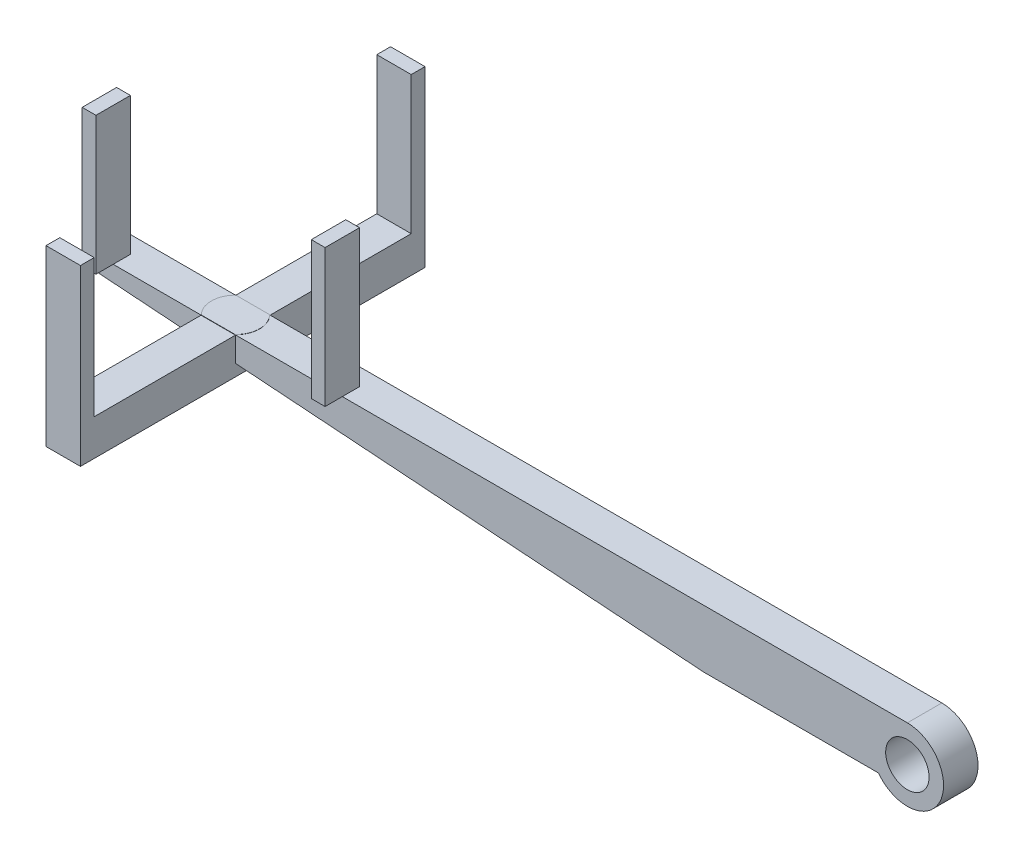
ISO-10303-21;
HEADER;
FILE_DESCRIPTION(('STEP AP214'),'2;1');
FILE_NAME('part.step','',(''),(''),'','','');
FILE_SCHEMA(('AUTOMOTIVE_DESIGN { 1 0 10303 214 1 1 1 1 }'));
ENDSEC;
DATA;
#1=APPLICATION_CONTEXT('core data for automotive mechanical design processes');
#2=APPLICATION_PROTOCOL_DEFINITION('international standard','automotive_design',2000,#1);
#3=PRODUCT_CONTEXT('',#1,'mechanical');
#4=PRODUCT('Part','Part','',(#3));
#5=PRODUCT_RELATED_PRODUCT_CATEGORY('part','',(#4));
#6=PRODUCT_DEFINITION_FORMATION('','',#4);
#7=PRODUCT_DEFINITION_CONTEXT('part definition',#1,'design');
#8=PRODUCT_DEFINITION('design','',#6,#7);
#9=PRODUCT_DEFINITION_SHAPE('','',#8);
#10=(LENGTH_UNIT() NAMED_UNIT(*) SI_UNIT(.MILLI.,.METRE.));
#11=(NAMED_UNIT(*) PLANE_ANGLE_UNIT() SI_UNIT($,.RADIAN.));
#12=(NAMED_UNIT(*) SI_UNIT($,.STERADIAN.) SOLID_ANGLE_UNIT());
#13=UNCERTAINTY_MEASURE_WITH_UNIT(LENGTH_MEASURE(1.E-05),#10,'distance_accuracy_value','');
#14=(GEOMETRIC_REPRESENTATION_CONTEXT(3) GLOBAL_UNCERTAINTY_ASSIGNED_CONTEXT((#13)) GLOBAL_UNIT_ASSIGNED_CONTEXT((#10,
#11,#12)) REPRESENTATION_CONTEXT('',''));
#15=CARTESIAN_POINT('',(0.,0.,0.));
#16=DIRECTION('',(0.,0.,1.));
#17=DIRECTION('',(1.,0.,0.));
#18=AXIS2_PLACEMENT_3D('',#15,#16,#17);
#19=CARTESIAN_POINT('',(-0.0500000000000828,10.5499999999999,5.));
#20=DIRECTION('',(0.,-1.,0.));
#21=DIRECTION('',(1.,0.,0.));
#22=AXIS2_PLACEMENT_3D('',#19,#20,#21);
#23=PLANE('',#22);
#24=DIRECTION('',(0.,0.,1.));
#25=VECTOR('',#24,1.);
#26=CARTESIAN_POINT('',(-230.552850517387,10.5500000000007,0.));
#27=LINE('',#26,#25);
#28=CARTESIAN_POINT('',(-230.552850517387,10.5500000000007,0.));
#29=VERTEX_POINT('',#28);
#30=CARTESIAN_POINT('',(-230.552850517387,10.5500000000007,5.));
#31=VERTEX_POINT('',#30);
#32=EDGE_CURVE('E348',#29,#31,#27,.T.);
#33=ORIENTED_EDGE('',*,*,#32,.T.);
#34=DIRECTION('',(-1.,0.,0.));
#35=VECTOR('',#34,1.);
#36=CARTESIAN_POINT('',(-0.0500000000000828,10.5499999999999,5.));
#37=LINE('',#36,#35);
#38=CARTESIAN_POINT('',(-204.948979485566,10.5500000000006,5.));
#39=VERTEX_POINT('',#38);
#40=EDGE_CURVE('E510',#39,#31,#37,.T.);
#41=ORIENTED_EDGE('',*,*,#40,.F.);
#42=CARTESIAN_POINT('',(-200.05,10.5500000000006,0.));
#43=DIRECTION('',(0.,1.,0.));
#44=DIRECTION('',(-1.,0.,0.));
#45=AXIS2_PLACEMENT_3D('',#42,#43,#44);
#46=CIRCLE('',#45,7.00000000000001);
#47=CARTESIAN_POINT('',(-204.948979485566,10.5500000000006,-5.));
#48=VERTEX_POINT('',#47);
#49=EDGE_CURVE('E416',#48,#39,#46,.T.);
#50=ORIENTED_EDGE('',*,*,#49,.F.);
#51=DIRECTION('',(-1.,0.,0.));
#52=VECTOR('',#51,1.);
#53=CARTESIAN_POINT('',(-0.0500000000000828,10.5499999999999,-5.));
#54=LINE('',#53,#52);
#55=CARTESIAN_POINT('',(-236.55,10.5500000000007,-5.));
#56=VERTEX_POINT('',#55);
#57=EDGE_CURVE('E536',#48,#56,#54,.T.);
#58=ORIENTED_EDGE('',*,*,#57,.T.);
#59=DIRECTION('',(0.,0.,-1.));
#60=VECTOR('',#59,1.);
#61=CARTESIAN_POINT('',(-236.55,10.5500000000007,5.));
#62=LINE('',#61,#60);
#63=CARTESIAN_POINT('',(-236.55,10.5500000000007,5.));
#64=VERTEX_POINT('',#63);
#65=EDGE_CURVE('E572',#64,#56,#62,.T.);
#66=ORIENTED_EDGE('',*,*,#65,.F.);
#67=CARTESIAN_POINT('',(-234.552850517388,10.5500000000007,5.));
#68=VERTEX_POINT('',#67);
#69=EDGE_CURVE('E503',#68,#64,#37,.T.);
#70=ORIENTED_EDGE('',*,*,#69,.F.);
#71=DIRECTION('',(0.,0.,1.));
#72=VECTOR('',#71,1.);
#73=CARTESIAN_POINT('',(-234.552850517448,10.5500000000007,0.));
#74=LINE('',#73,#72);
#75=CARTESIAN_POINT('',(-234.552850517448,10.5500000000007,0.));
#76=VERTEX_POINT('',#75);
#77=EDGE_CURVE('E353',#76,#68,#74,.T.);
#78=ORIENTED_EDGE('',*,*,#77,.F.);
#79=DIRECTION('',(-1.,0.,0.));
#80=VECTOR('',#79,1.);
#81=CARTESIAN_POINT('',(0.,10.5499999999999,0.));
#82=LINE('',#81,#80);
#83=EDGE_CURVE('E331',#29,#76,#82,.T.);
#84=ORIENTED_EDGE('',*,*,#83,.F.);
#85=EDGE_LOOP('',(#33,#41,#50,#58,#66,#70,#78,#84));
#86=FACE_BOUND('',#85,.T.);
#87=ADVANCED_FACE('F43',(#86),#23,.F.);
#88=DIRECTION('',(-1.,0.,0.));
#89=VECTOR('',#88,1.);
#90=CARTESIAN_POINT('',(0.,10.5499999999999,0.));
#91=LINE('',#90,#89);
#92=CARTESIAN_POINT('',(-164.05,10.5500000000005,0.));
#93=VERTEX_POINT('',#92);
#94=CARTESIAN_POINT('',(-168.05,10.5500000000005,0.));
#95=VERTEX_POINT('',#94);
#96=EDGE_CURVE('E374',#93,#95,#91,.T.);
#97=ORIENTED_EDGE('',*,*,#96,.F.);
#98=DIRECTION('',(0.,0.,1.));
#99=VECTOR('',#98,1.);
#100=CARTESIAN_POINT('',(-164.05,10.5500000000005,0.));
#101=LINE('',#100,#99);
#102=CARTESIAN_POINT('',(-164.05,10.5500000000005,5.));
#103=VERTEX_POINT('',#102);
#104=EDGE_CURVE('E400',#93,#103,#101,.T.);
#105=ORIENTED_EDGE('',*,*,#104,.T.);
#106=CARTESIAN_POINT('',(-0.0500000000000827,10.5499999999999,5.));
#107=VERTEX_POINT('',#106);
#108=EDGE_CURVE('E504',#107,#103,#37,.T.);
#109=ORIENTED_EDGE('',*,*,#108,.F.);
#110=DIRECTION('',(0.,0.,-1.));
#111=VECTOR('',#110,1.);
#112=CARTESIAN_POINT('',(-0.0500000000000827,10.5499999999999,5.));
#113=LINE('',#112,#111);
#114=CARTESIAN_POINT('',(-0.0500000000000827,10.5499999999999,-5.));
#115=VERTEX_POINT('',#114);
#116=EDGE_CURVE('E576',#107,#115,#113,.T.);
#117=ORIENTED_EDGE('',*,*,#116,.T.);
#118=CARTESIAN_POINT('',(-195.151020514434,10.5500000000006,-5.));
#119=VERTEX_POINT('',#118);
#120=EDGE_CURVE('E537',#115,#119,#54,.T.);
#121=ORIENTED_EDGE('',*,*,#120,.T.);
#122=CARTESIAN_POINT('',(-195.151020514434,10.5500000000006,5.));
#123=VERTEX_POINT('',#122);
#124=EDGE_CURVE('E399',#123,#119,#46,.T.);
#125=ORIENTED_EDGE('',*,*,#124,.F.);
#126=CARTESIAN_POINT('',(-168.05,10.5500000000005,5.));
#127=VERTEX_POINT('',#126);
#128=EDGE_CURVE('E651',#127,#123,#37,.T.);
#129=ORIENTED_EDGE('',*,*,#128,.F.);
#130=DIRECTION('',(0.,0.,1.));
#131=VECTOR('',#130,1.);
#132=CARTESIAN_POINT('',(-168.05,10.5500000000005,0.));
#133=LINE('',#132,#131);
#134=EDGE_CURVE('E405',#95,#127,#133,.T.);
#135=ORIENTED_EDGE('',*,*,#134,.F.);
#136=EDGE_LOOP('',(#97,#105,#109,#117,#121,#125,#129,#135));
#137=FACE_BOUND('',#136,.T.);
#138=ADVANCED_FACE('F671',(#137),#23,.F.);
#139=CARTESIAN_POINT('',(-0.79213250000149,-10.3972819196618,5.));
#140=DIRECTION('',(-0.0708573888598422,-0.997486456270944,0.));
#141=DIRECTION('',(0.997486456270944,-0.0708573888598422,0.));
#142=AXIS2_PLACEMENT_3D('',#139,#140,#141);
#143=PLANE('',#142);
#144=DIRECTION('',(-0.997486456270944,0.0708573888598422,0.));
#145=VECTOR('',#144,1.);
#146=CARTESIAN_POINT('',(-0.79213250000149,-10.3972819196618,-5.));
#147=LINE('',#146,#145);
#148=CARTESIAN_POINT('',(-205.05,4.11236786469404,-5.));
#149=VERTEX_POINT('',#148);
#150=CARTESIAN_POINT('',(-236.55,6.3500000000007,-5.));
#151=VERTEX_POINT('',#150);
#152=EDGE_CURVE('E544',#149,#151,#147,.T.);
#153=ORIENTED_EDGE('',*,*,#152,.F.);
#154=DIRECTION('',(0.,0.,1.));
#155=VECTOR('',#154,1.);
#156=CARTESIAN_POINT('',(-205.05,4.11236786469404,5.));
#157=LINE('',#156,#155);
#158=CARTESIAN_POINT('',(-205.05,4.11236786469404,5.));
#159=VERTEX_POINT('',#158);
#160=EDGE_CURVE('E486',#149,#159,#157,.T.);
#161=ORIENTED_EDGE('',*,*,#160,.T.);
#162=DIRECTION('',(-0.997486456270944,0.0708573888598422,0.));
#163=VECTOR('',#162,1.);
#164=CARTESIAN_POINT('',(-0.79213250000149,-10.3972819196618,5.));
#165=LINE('',#164,#163);
#166=CARTESIAN_POINT('',(-236.55,6.3500000000007,5.));
#167=VERTEX_POINT('',#166);
#168=EDGE_CURVE('E514',#159,#167,#165,.T.);
#169=ORIENTED_EDGE('',*,*,#168,.T.);
#170=DIRECTION('',(0.,0.,-1.));
#171=VECTOR('',#170,1.);
#172=CARTESIAN_POINT('',(-236.55,6.3500000000007,5.));
#173=LINE('',#172,#171);
#174=EDGE_CURVE('E568',#167,#151,#173,.T.);
#175=ORIENTED_EDGE('',*,*,#174,.T.);
#176=EDGE_LOOP('',(#153,#161,#169,#175));
#177=FACE_BOUND('',#176,.T.);
#178=ADVANCED_FACE('F699',(#177),#143,.T.);
#179=CARTESIAN_POINT('',(-0.0500000000001194,0.0499999999998835,5.));
#180=DIRECTION('',(0.,0.,1.));
#181=DIRECTION('',(0.,-1.,0.));
#182=AXIS2_PLACEMENT_3D('',#179,#180,#181);
#183=PLANE('',#182);
#184=CARTESIAN_POINT('',(-0.0500000000001194,0.0499999999998835,5.));
#185=DIRECTION('',(0.,0.,1.));
#186=DIRECTION('',(0.,-1.,0.));
#187=AXIS2_PLACEMENT_3D('',#184,#185,#186);
#188=CIRCLE('',#187,6.3);
#189=CARTESIAN_POINT('',(-0.0500000000001414,-6.25000000000012,5.));
#190=VERTEX_POINT('',#189);
#191=EDGE_CURVE('E525',#190,#190,#188,.T.);
#192=ORIENTED_EDGE('',*,*,#191,.F.);
#193=EDGE_LOOP('',(#192));
#194=FACE_BOUND('',#193,.T.);
#195=ORIENTED_EDGE('',*,*,#168,.F.);
#196=DIRECTION('',(0.,1.,0.));
#197=VECTOR('',#196,1.);
#198=CARTESIAN_POINT('',(-205.05,0.0499999999998835,5.));
#199=LINE('',#198,#197);
#200=CARTESIAN_POINT('',(-205.05,10.5,5.));
#201=VERTEX_POINT('',#200);
#202=EDGE_CURVE('E490',#159,#201,#199,.T.);
#203=ORIENTED_EDGE('',*,*,#202,.T.);
#204=DIRECTION('',(-1.,0.,0.));
#205=VECTOR('',#204,1.);
#206=CARTESIAN_POINT('',(-0.0500000000001194,10.5,5.));
#207=LINE('',#206,#205);
#208=CARTESIAN_POINT('',(-195.05,10.5,5.));
#209=VERTEX_POINT('',#208);
#210=EDGE_CURVE('E477',#209,#201,#207,.T.);
#211=ORIENTED_EDGE('',*,*,#210,.F.);
#212=DIRECTION('',(0.,1.,0.));
#213=VECTOR('',#212,1.);
#214=CARTESIAN_POINT('',(-195.05,0.0499999999998835,5.));
#215=LINE('',#214,#213);
#216=CARTESIAN_POINT('',(-195.05,3.40200845666018,5.));
#217=VERTEX_POINT('',#216);
#218=EDGE_CURVE('E483',#217,#209,#215,.T.);
#219=ORIENTED_EDGE('',*,*,#218,.F.);
#220=CARTESIAN_POINT('',(-59.1750000000001,-6.24999999999991,5.));
#221=VERTEX_POINT('',#220);
#222=EDGE_CURVE('E515',#221,#217,#165,.T.);
#223=ORIENTED_EDGE('',*,*,#222,.F.);
#224=DIRECTION('',(1.,0.,0.));
#225=VECTOR('',#224,1.);
#226=CARTESIAN_POINT('',(-0.0500000000001413,-6.25000000000012,5.));
#227=LINE('',#226,#225);
#228=CARTESIAN_POINT('',(-8.45000000000014,-6.25000000000009,5.));
#229=VERTEX_POINT('',#228);
#230=EDGE_CURVE('E519',#221,#229,#227,.T.);
#231=ORIENTED_EDGE('',*,*,#230,.T.);
#232=CARTESIAN_POINT('',(-0.0500000000001194,0.0499999999998835,5.));
#233=DIRECTION('',(0.,0.,1.));
#234=DIRECTION('',(0.,-1.,0.));
#235=AXIS2_PLACEMENT_3D('',#232,#233,#234);
#236=CIRCLE('',#235,10.5);
#237=CARTESIAN_POINT('',(-1.53426500000282,-10.3445638393234,5.));
#238=VERTEX_POINT('',#237);
#239=EDGE_CURVE('E522',#229,#238,#236,.T.);
#240=ORIENTED_EDGE('',*,*,#239,.T.);
#241=DIRECTION('',(-0.997486456270944,0.0708573888598422,0.));
#242=VECTOR('',#241,1.);
#243=CARTESIAN_POINT('',(-0.79213250000149,-10.3972819196618,5.));
#244=LINE('',#243,#242);
#245=CARTESIAN_POINT('',(-0.0500000000001561,-10.4500000000001,5.));
#246=VERTEX_POINT('',#245);
#247=EDGE_CURVE('E495',#246,#238,#244,.T.);
#248=ORIENTED_EDGE('',*,*,#247,.F.);
#249=CARTESIAN_POINT('',(-0.0500000000001194,0.0499999999998835,5.));
#250=DIRECTION('',(0.,0.,1.));
#251=DIRECTION('',(0.,-1.,0.));
#252=AXIS2_PLACEMENT_3D('',#249,#250,#251);
#253=CIRCLE('',#252,10.5);
#254=EDGE_CURVE('E499',#246,#107,#253,.T.);
#255=ORIENTED_EDGE('',*,*,#254,.T.);
#256=ORIENTED_EDGE('',*,*,#108,.T.);
#257=EDGE_CURVE('E509',#103,#127,#37,.T.);
#258=ORIENTED_EDGE('',*,*,#257,.T.);
#259=ORIENTED_EDGE('',*,*,#128,.T.);
#260=DIRECTION('',(0.,-1.,0.));
#261=VECTOR('',#260,1.);
#262=CARTESIAN_POINT('',(-195.151020514434,10.6000000000006,5.));
#263=LINE('',#262,#261);
#264=CARTESIAN_POINT('',(-195.151020514434,10.6000000000006,5.));
#265=VERTEX_POINT('',#264);
#266=EDGE_CURVE('E438',#265,#123,#263,.T.);
#267=ORIENTED_EDGE('',*,*,#266,.F.);
#268=DIRECTION('',(1.,0.,0.));
#269=VECTOR('',#268,1.);
#270=CARTESIAN_POINT('',(0.,10.5999999999999,5.));
#271=LINE('',#270,#269);
#272=CARTESIAN_POINT('',(-204.948979485566,10.6000000000006,5.));
#273=VERTEX_POINT('',#272);
#274=EDGE_CURVE('E411',#273,#265,#271,.T.);
#275=ORIENTED_EDGE('',*,*,#274,.F.);
#276=DIRECTION('',(0.,-1.,0.));
#277=VECTOR('',#276,1.);
#278=CARTESIAN_POINT('',(-204.948979485566,10.6000000000006,5.));
#279=LINE('',#278,#277);
#280=EDGE_CURVE('E426',#273,#39,#279,.T.);
#281=ORIENTED_EDGE('',*,*,#280,.T.);
#282=ORIENTED_EDGE('',*,*,#40,.T.);
#283=EDGE_CURVE('E649',#31,#68,#37,.T.);
#284=ORIENTED_EDGE('',*,*,#283,.T.);
#285=ORIENTED_EDGE('',*,*,#69,.T.);
#286=DIRECTION('',(0.,-1.,0.));
#287=VECTOR('',#286,1.);
#288=CARTESIAN_POINT('',(-236.55,0.0500000000007161,5.));
#289=LINE('',#288,#287);
#290=EDGE_CURVE('E508',#64,#167,#289,.T.);
#291=ORIENTED_EDGE('',*,*,#290,.T.);
#292=EDGE_LOOP('',(#195,#203,#211,#219,#223,#231,#240,#248,#255,#256,#258,#259,#267,#275,#281,
#282,#284,#285,#291));
#293=FACE_BOUND('',#292,.T.);
#294=ADVANCED_FACE('F602',(#194,#293),#183,.T.);
#295=CARTESIAN_POINT('',(-0.0500000000001194,0.0499999999998835,-5.));
#296=DIRECTION('',(0.,0.,1.));
#297=DIRECTION('',(0.,-1.,0.));
#298=AXIS2_PLACEMENT_3D('',#295,#296,#297);
#299=PLANE('',#298);
#300=CARTESIAN_POINT('',(-0.0500000000001194,0.0499999999998835,-5.));
#301=DIRECTION('',(0.,0.,1.));
#302=DIRECTION('',(0.,-1.,0.));
#303=AXIS2_PLACEMENT_3D('',#300,#301,#302);
#304=CIRCLE('',#303,6.3);
#305=CARTESIAN_POINT('',(-0.0500000000001414,-6.25000000000012,-5.));
#306=VERTEX_POINT('',#305);
#307=EDGE_CURVE('E500',#306,#306,#304,.T.);
#308=ORIENTED_EDGE('',*,*,#307,.T.);
#309=EDGE_LOOP('',(#308));
#310=FACE_BOUND('',#309,.T.);
#311=DIRECTION('',(0.,1.,0.));
#312=VECTOR('',#311,1.);
#313=CARTESIAN_POINT('',(-205.05,0.0499999999998835,-5.));
#314=LINE('',#313,#312);
#315=CARTESIAN_POINT('',(-205.05,10.5,-5.));
#316=VERTEX_POINT('',#315);
#317=EDGE_CURVE('E11',#149,#316,#314,.T.);
#318=ORIENTED_EDGE('',*,*,#317,.F.);
#319=ORIENTED_EDGE('',*,*,#152,.T.);
#320=DIRECTION('',(0.,-1.,0.));
#321=VECTOR('',#320,1.);
#322=CARTESIAN_POINT('',(-236.55,0.0500000000007161,-5.));
#323=LINE('',#322,#321);
#324=EDGE_CURVE('E540',#56,#151,#323,.T.);
#325=ORIENTED_EDGE('',*,*,#324,.F.);
#326=ORIENTED_EDGE('',*,*,#57,.F.);
#327=DIRECTION('',(0.,-1.,0.));
#328=VECTOR('',#327,1.);
#329=CARTESIAN_POINT('',(-204.948979485566,10.6000000000006,-5.));
#330=LINE('',#329,#328);
#331=CARTESIAN_POINT('',(-204.948979485566,10.6000000000006,-5.));
#332=VERTEX_POINT('',#331);
#333=EDGE_CURVE('E430',#332,#48,#330,.T.);
#334=ORIENTED_EDGE('',*,*,#333,.F.);
#335=DIRECTION('',(-1.,0.,0.));
#336=VECTOR('',#335,1.);
#337=CARTESIAN_POINT('',(0.,10.5999999999999,-5.));
#338=LINE('',#337,#336);
#339=CARTESIAN_POINT('',(-195.151020514434,10.6000000000006,-5.));
#340=VERTEX_POINT('',#339);
#341=EDGE_CURVE('E419',#340,#332,#338,.T.);
#342=ORIENTED_EDGE('',*,*,#341,.F.);
#343=DIRECTION('',(0.,-1.,0.));
#344=VECTOR('',#343,1.);
#345=CARTESIAN_POINT('',(-195.151020514434,10.6000000000006,-5.));
#346=LINE('',#345,#344);
#347=EDGE_CURVE('E434',#340,#119,#346,.T.);
#348=ORIENTED_EDGE('',*,*,#347,.T.);
#349=ORIENTED_EDGE('',*,*,#120,.F.);
#350=CARTESIAN_POINT('',(-0.0500000000001194,0.0499999999998835,-5.));
#351=DIRECTION('',(0.,0.,1.));
#352=DIRECTION('',(0.,-1.,0.));
#353=AXIS2_PLACEMENT_3D('',#350,#351,#352);
#354=CIRCLE('',#353,10.5);
#355=CARTESIAN_POINT('',(-0.0500000000001561,-10.4500000000001,-5.));
#356=VERTEX_POINT('',#355);
#357=EDGE_CURVE('E533',#356,#115,#354,.T.);
#358=ORIENTED_EDGE('',*,*,#357,.F.);
#359=DIRECTION('',(-0.997486456270944,0.0708573888598422,0.));
#360=VECTOR('',#359,1.);
#361=CARTESIAN_POINT('',(-0.79213250000149,-10.3972819196618,-5.));
#362=LINE('',#361,#360);
#363=CARTESIAN_POINT('',(-1.53426500000282,-10.3445638393234,-5.));
#364=VERTEX_POINT('',#363);
#365=EDGE_CURVE('E494',#356,#364,#362,.T.);
#366=ORIENTED_EDGE('',*,*,#365,.T.);
#367=CARTESIAN_POINT('',(-0.0500000000001194,0.0499999999998835,-5.));
#368=DIRECTION('',(0.,0.,1.));
#369=DIRECTION('',(0.,-1.,0.));
#370=AXIS2_PLACEMENT_3D('',#367,#368,#369);
#371=CIRCLE('',#370,10.5);
#372=CARTESIAN_POINT('',(-8.45000000000014,-6.25000000000009,-5.));
#373=VERTEX_POINT('',#372);
#374=EDGE_CURVE('E552',#373,#364,#371,.T.);
#375=ORIENTED_EDGE('',*,*,#374,.F.);
#376=DIRECTION('',(1.,0.,0.));
#377=VECTOR('',#376,1.);
#378=CARTESIAN_POINT('',(-0.0500000000001413,-6.25000000000012,-5.));
#379=LINE('',#378,#377);
#380=CARTESIAN_POINT('',(-59.1750000000001,-6.24999999999991,-5.));
#381=VERTEX_POINT('',#380);
#382=EDGE_CURVE('E549',#381,#373,#379,.T.);
#383=ORIENTED_EDGE('',*,*,#382,.F.);
#384=CARTESIAN_POINT('',(-195.05,3.40200845666018,-5.));
#385=VERTEX_POINT('',#384);
#386=EDGE_CURVE('E545',#381,#385,#147,.T.);
#387=ORIENTED_EDGE('',*,*,#386,.T.);
#388=DIRECTION('',(0.,1.,0.));
#389=VECTOR('',#388,1.);
#390=CARTESIAN_POINT('',(-195.05,0.0499999999998835,-5.));
#391=LINE('',#390,#389);
#392=CARTESIAN_POINT('',(-195.05,10.5,-5.));
#393=VERTEX_POINT('',#392);
#394=EDGE_CURVE('E52',#385,#393,#391,.T.);
#395=ORIENTED_EDGE('',*,*,#394,.T.);
#396=DIRECTION('',(-1.,0.,0.));
#397=VECTOR('',#396,1.);
#398=CARTESIAN_POINT('',(-0.0500000000001194,10.5,-5.));
#399=LINE('',#398,#397);
#400=EDGE_CURVE('E583',#393,#316,#399,.T.);
#401=ORIENTED_EDGE('',*,*,#400,.T.);
#402=EDGE_LOOP('',(#318,#319,#325,#326,#334,#342,#348,#349,#358,#366,#375,#383,#387,#395,#401));
#403=FACE_BOUND('',#402,.T.);
#404=ADVANCED_FACE('F590',(#310,#403),#299,.F.);
#405=CARTESIAN_POINT('',(-0.79213250000149,-10.3972819196618,5.));
#406=DIRECTION('',(-0.0708573888598422,-0.997486456270944,0.));
#407=DIRECTION('',(0.997486456270944,-0.0708573888598422,0.));
#408=AXIS2_PLACEMENT_3D('',#405,#406,#407);
#409=PLANE('',#408);
#410=ORIENTED_EDGE('',*,*,#365,.F.);
#411=DIRECTION('',(0.,0.,-1.));
#412=VECTOR('',#411,1.);
#413=CARTESIAN_POINT('',(-0.0500000000001561,-10.4500000000001,5.));
#414=LINE('',#413,#412);
#415=EDGE_CURVE('E580',#246,#356,#414,.T.);
#416=ORIENTED_EDGE('',*,*,#415,.F.);
#417=ORIENTED_EDGE('',*,*,#247,.T.);
#418=DIRECTION('',(0.,0.,-1.));
#419=VECTOR('',#418,1.);
#420=CARTESIAN_POINT('',(-1.53426500000282,-10.3445638393234,5.));
#421=LINE('',#420,#419);
#422=EDGE_CURVE('E529',#238,#364,#421,.T.);
#423=ORIENTED_EDGE('',*,*,#422,.T.);
#424=EDGE_LOOP('',(#410,#416,#417,#423));
#425=FACE_BOUND('',#424,.T.);
#426=ADVANCED_FACE('F45',(#425),#409,.T.);
#427=CARTESIAN_POINT('',(-0.0500000000001194,0.0499999999998835,5.));
#428=DIRECTION('',(0.,0.,-1.));
#429=DIRECTION('',(0.,1.,0.));
#430=AXIS2_PLACEMENT_3D('',#427,#428,#429);
#431=CYLINDRICAL_SURFACE('',#430,10.5);
#432=ORIENTED_EDGE('',*,*,#357,.T.);
#433=ORIENTED_EDGE('',*,*,#116,.F.);
#434=ORIENTED_EDGE('',*,*,#254,.F.);
#435=ORIENTED_EDGE('',*,*,#415,.T.);
#436=EDGE_LOOP('',(#432,#433,#434,#435));
#437=FACE_BOUND('',#436,.T.);
#438=ADVANCED_FACE('F703',(#437),#431,.T.);
#439=CARTESIAN_POINT('',(-236.55,0.0500000000007161,5.));
#440=DIRECTION('',(1.,0.,0.));
#441=DIRECTION('',(0.,0.,1.));
#442=AXIS2_PLACEMENT_3D('',#439,#440,#441);
#443=PLANE('',#442);
#444=ORIENTED_EDGE('',*,*,#324,.T.);
#445=ORIENTED_EDGE('',*,*,#174,.F.);
#446=ORIENTED_EDGE('',*,*,#290,.F.);
#447=ORIENTED_EDGE('',*,*,#65,.T.);
#448=EDGE_LOOP('',(#444,#445,#446,#447));
#449=FACE_BOUND('',#448,.T.);
#450=ADVANCED_FACE('F701',(#449),#443,.F.);
#451=DIRECTION('',(0.,0.,1.));
#452=VECTOR('',#451,1.);
#453=CARTESIAN_POINT('',(-195.05,3.40200845666018,5.));
#454=LINE('',#453,#452);
#455=EDGE_CURVE('E480',#385,#217,#454,.T.);
#456=ORIENTED_EDGE('',*,*,#455,.F.);
#457=ORIENTED_EDGE('',*,*,#386,.F.);
#458=DIRECTION('',(0.,0.,-1.));
#459=VECTOR('',#458,1.);
#460=CARTESIAN_POINT('',(-59.1750000000001,-6.24999999999991,5.));
#461=LINE('',#460,#459);
#462=EDGE_CURVE('E565',#221,#381,#461,.T.);
#463=ORIENTED_EDGE('',*,*,#462,.F.);
#464=ORIENTED_EDGE('',*,*,#222,.T.);
#465=EDGE_LOOP('',(#456,#457,#463,#464));
#466=FACE_BOUND('',#465,.T.);
#467=ADVANCED_FACE('F597',(#466),#143,.T.);
#468=CARTESIAN_POINT('',(-0.0500000000001413,-6.25000000000012,5.));
#469=DIRECTION('',(0.,1.,0.));
#470=DIRECTION('',(-1.,0.,0.));
#471=AXIS2_PLACEMENT_3D('',#468,#469,#470);
#472=PLANE('',#471);
#473=ORIENTED_EDGE('',*,*,#382,.T.);
#474=DIRECTION('',(0.,0.,-1.));
#475=VECTOR('',#474,1.);
#476=CARTESIAN_POINT('',(-8.45000000000014,-6.25000000000009,5.));
#477=LINE('',#476,#475);
#478=EDGE_CURVE('E561',#229,#373,#477,.T.);
#479=ORIENTED_EDGE('',*,*,#478,.F.);
#480=ORIENTED_EDGE('',*,*,#230,.F.);
#481=ORIENTED_EDGE('',*,*,#462,.T.);
#482=EDGE_LOOP('',(#473,#479,#480,#481));
#483=FACE_BOUND('',#482,.T.);
#484=ADVANCED_FACE('F792',(#483),#472,.F.);
#485=CARTESIAN_POINT('',(-0.0500000000001194,0.0499999999998835,5.));
#486=DIRECTION('',(0.,0.,-1.));
#487=DIRECTION('',(0.,1.,0.));
#488=AXIS2_PLACEMENT_3D('',#485,#486,#487);
#489=CYLINDRICAL_SURFACE('',#488,10.5);
#490=ORIENTED_EDGE('',*,*,#374,.T.);
#491=ORIENTED_EDGE('',*,*,#422,.F.);
#492=ORIENTED_EDGE('',*,*,#239,.F.);
#493=ORIENTED_EDGE('',*,*,#478,.T.);
#494=EDGE_LOOP('',(#490,#491,#492,#493));
#495=FACE_BOUND('',#494,.T.);
#496=ADVANCED_FACE('F766',(#495),#489,.T.);
#497=CARTESIAN_POINT('',(-0.0500000000001194,0.0499999999998835,5.));
#498=DIRECTION('',(0.,0.,-1.));
#499=DIRECTION('',(0.,1.,0.));
#500=AXIS2_PLACEMENT_3D('',#497,#498,#499);
#501=CYLINDRICAL_SURFACE('',#500,6.3);
#502=ORIENTED_EDGE('',*,*,#191,.T.);
#503=EDGE_LOOP('',(#502));
#504=FACE_BOUND('',#503,.T.);
#505=ORIENTED_EDGE('',*,*,#307,.F.);
#506=EDGE_LOOP('',(#505));
#507=FACE_BOUND('',#506,.T.);
#508=ADVANCED_FACE('F759',(#504,#507),#501,.F.);
#509=CARTESIAN_POINT('',(0.,10.5,-5.));
#510=DIRECTION('',(0.,1.,0.));
#511=DIRECTION('',(0.,0.,1.));
#512=AXIS2_PLACEMENT_3D('',#509,#510,#511);
#513=PLANE('',#512);
#514=DIRECTION('',(-1.,0.,0.));
#515=VECTOR('',#514,1.);
#516=CARTESIAN_POINT('',(-195.05,10.5,-46.));
#517=LINE('',#516,#515);
#518=CARTESIAN_POINT('',(-195.05,10.5,-46.));
#519=VERTEX_POINT('',#518);
#520=CARTESIAN_POINT('',(-205.05,10.5,-46.));
#521=VERTEX_POINT('',#520);
#522=EDGE_CURVE('E279',#519,#521,#517,.T.);
#523=ORIENTED_EDGE('',*,*,#522,.T.);
#524=DIRECTION('',(0.,0.,1.));
#525=VECTOR('',#524,1.);
#526=CARTESIAN_POINT('',(-205.05,10.5,-5.));
#527=LINE('',#526,#525);
#528=EDGE_CURVE('E443',#521,#316,#527,.T.);
#529=ORIENTED_EDGE('',*,*,#528,.T.);
#530=ORIENTED_EDGE('',*,*,#400,.F.);
#531=DIRECTION('',(0.,0.,1.));
#532=VECTOR('',#531,1.);
#533=CARTESIAN_POINT('',(-195.05,10.5,-5.));
#534=LINE('',#533,#532);
#535=EDGE_CURVE('E447',#519,#393,#534,.T.);
#536=ORIENTED_EDGE('',*,*,#535,.F.);
#537=EDGE_LOOP('',(#523,#529,#530,#536));
#538=FACE_BOUND('',#537,.T.);
#539=ADVANCED_FACE('F757',(#538),#513,.T.);
#540=CARTESIAN_POINT('',(0.,10.5,-50.));
#541=DIRECTION('',(0.,0.,1.));
#542=DIRECTION('',(1.,0.,0.));
#543=AXIS2_PLACEMENT_3D('',#540,#541,#542);
#544=PLANE('',#543);
#545=DIRECTION('',(-1.,0.,0.));
#546=VECTOR('',#545,1.);
#547=CARTESIAN_POINT('',(0.,0.,-50.));
#548=LINE('',#547,#546);
#549=CARTESIAN_POINT('',(-195.05,0.,-50.));
#550=VERTEX_POINT('',#549);
#551=CARTESIAN_POINT('',(-205.05,0.,-50.));
#552=VERTEX_POINT('',#551);
#553=EDGE_CURVE('E442',#550,#552,#548,.T.);
#554=ORIENTED_EDGE('',*,*,#553,.T.);
#555=DIRECTION('',(0.,-1.,0.));
#556=VECTOR('',#555,1.);
#557=CARTESIAN_POINT('',(-205.05,10.5,-50.));
#558=LINE('',#557,#556);
#559=CARTESIAN_POINT('',(-205.05,50.5,-50.));
#560=VERTEX_POINT('',#559);
#561=EDGE_CURVE('E473',#560,#552,#558,.T.);
#562=ORIENTED_EDGE('',*,*,#561,.F.);
#563=DIRECTION('',(-1.,0.,0.));
#564=VECTOR('',#563,1.);
#565=CARTESIAN_POINT('',(-195.05,50.5,-50.));
#566=LINE('',#565,#564);
#567=CARTESIAN_POINT('',(-195.05,50.5,-50.));
#568=VERTEX_POINT('',#567);
#569=EDGE_CURVE('E269',#568,#560,#566,.T.);
#570=ORIENTED_EDGE('',*,*,#569,.F.);
#571=DIRECTION('',(0.,-1.,0.));
#572=VECTOR('',#571,1.);
#573=CARTESIAN_POINT('',(-195.05,10.5,-50.));
#574=LINE('',#573,#572);
#575=EDGE_CURVE('E273',#568,#550,#574,.T.);
#576=ORIENTED_EDGE('',*,*,#575,.T.);
#577=EDGE_LOOP('',(#554,#562,#570,#576));
#578=FACE_BOUND('',#577,.T.);
#579=ADVANCED_FACE('F754',(#578),#544,.F.);
#580=CARTESIAN_POINT('',(-205.05,10.5,-5.));
#581=DIRECTION('',(1.,0.,0.));
#582=DIRECTION('',(0.,0.,-1.));
#583=AXIS2_PLACEMENT_3D('',#580,#581,#582);
#584=PLANE('',#583);
#585=ORIENTED_EDGE('',*,*,#202,.F.);
#586=ORIENTED_EDGE('',*,*,#160,.F.);
#587=ORIENTED_EDGE('',*,*,#317,.T.);
#588=ORIENTED_EDGE('',*,*,#528,.F.);
#589=DIRECTION('',(0.,1.,0.));
#590=VECTOR('',#589,1.);
#591=CARTESIAN_POINT('',(-205.05,50.5,-46.));
#592=LINE('',#591,#590);
#593=CARTESIAN_POINT('',(-205.05,50.5,-46.));
#594=VERTEX_POINT('',#593);
#595=EDGE_CURVE('E284',#521,#594,#592,.T.);
#596=ORIENTED_EDGE('',*,*,#595,.T.);
#597=DIRECTION('',(0.,0.,-1.));
#598=VECTOR('',#597,1.);
#599=CARTESIAN_POINT('',(-205.05,50.5,-50.));
#600=LINE('',#599,#598);
#601=EDGE_CURVE('E265',#594,#560,#600,.T.);
#602=ORIENTED_EDGE('',*,*,#601,.T.);
#603=ORIENTED_EDGE('',*,*,#561,.T.);
#604=DIRECTION('',(0.,0.,1.));
#605=VECTOR('',#604,1.);
#606=CARTESIAN_POINT('',(-205.05,0.,-5.));
#607=LINE('',#606,#605);
#608=CARTESIAN_POINT('',(-205.05,0.,50.));
#609=VERTEX_POINT('',#608);
#610=EDGE_CURVE('E453',#552,#609,#607,.T.);
#611=ORIENTED_EDGE('',*,*,#610,.T.);
#612=DIRECTION('',(0.,-1.,0.));
#613=VECTOR('',#612,1.);
#614=CARTESIAN_POINT('',(-205.05,10.5,50.));
#615=LINE('',#614,#613);
#616=CARTESIAN_POINT('',(-205.05,50.5,50.));
#617=VERTEX_POINT('',#616);
#618=EDGE_CURVE('E470',#617,#609,#615,.T.);
#619=ORIENTED_EDGE('',*,*,#618,.F.);
#620=DIRECTION('',(0.,0.,-1.));
#621=VECTOR('',#620,1.);
#622=CARTESIAN_POINT('',(-205.05,50.5,45.9999999999999));
#623=LINE('',#622,#621);
#624=CARTESIAN_POINT('',(-205.05,50.5,45.9999999999999));
#625=VERTEX_POINT('',#624);
#626=EDGE_CURVE('E291',#617,#625,#623,.T.);
#627=ORIENTED_EDGE('',*,*,#626,.T.);
#628=DIRECTION('',(0.,-1.,0.));
#629=VECTOR('',#628,1.);
#630=CARTESIAN_POINT('',(-205.05,10.5,45.9999999999999));
#631=LINE('',#630,#629);
#632=CARTESIAN_POINT('',(-205.05,10.5,45.9999999999999));
#633=VERTEX_POINT('',#632);
#634=EDGE_CURVE('E299',#625,#633,#631,.T.);
#635=ORIENTED_EDGE('',*,*,#634,.T.);
#636=EDGE_CURVE('E67',#201,#633,#527,.T.);
#637=ORIENTED_EDGE('',*,*,#636,.F.);
#638=EDGE_LOOP('',(#585,#586,#587,#588,#596,#602,#603,#611,#619,#627,#635,#637));
#639=FACE_BOUND('',#638,.T.);
#640=ADVANCED_FACE('F738',(#639),#584,.F.);
#641=CARTESIAN_POINT('',(0.,10.5,50.));
#642=DIRECTION('',(0.,0.,1.));
#643=DIRECTION('',(1.,0.,0.));
#644=AXIS2_PLACEMENT_3D('',#641,#642,#643);
#645=PLANE('',#644);
#646=DIRECTION('',(-1.,0.,0.));
#647=VECTOR('',#646,1.);
#648=CARTESIAN_POINT('',(0.,0.,50.));
#649=LINE('',#648,#647);
#650=CARTESIAN_POINT('',(-195.05,0.,50.));
#651=VERTEX_POINT('',#650);
#652=EDGE_CURVE('E457',#651,#609,#649,.T.);
#653=ORIENTED_EDGE('',*,*,#652,.F.);
#654=DIRECTION('',(0.,-1.,0.));
#655=VECTOR('',#654,1.);
#656=CARTESIAN_POINT('',(-195.05,10.5,50.));
#657=LINE('',#656,#655);
#658=CARTESIAN_POINT('',(-195.05,50.5,50.));
#659=VERTEX_POINT('',#658);
#660=EDGE_CURVE('E467',#659,#651,#657,.T.);
#661=ORIENTED_EDGE('',*,*,#660,.F.);
#662=DIRECTION('',(-1.,0.,0.));
#663=VECTOR('',#662,1.);
#664=CARTESIAN_POINT('',(-195.05,50.5,50.));
#665=LINE('',#664,#663);
#666=EDGE_CURVE('E303',#659,#617,#665,.T.);
#667=ORIENTED_EDGE('',*,*,#666,.T.);
#668=ORIENTED_EDGE('',*,*,#618,.T.);
#669=EDGE_LOOP('',(#653,#661,#667,#668));
#670=FACE_BOUND('',#669,.T.);
#671=ADVANCED_FACE('F749',(#670),#645,.T.);
#672=CARTESIAN_POINT('',(-195.05,10.5,-5.));
#673=DIRECTION('',(1.,0.,0.));
#674=DIRECTION('',(0.,0.,-1.));
#675=AXIS2_PLACEMENT_3D('',#672,#673,#674);
#676=PLANE('',#675);
#677=ORIENTED_EDGE('',*,*,#455,.T.);
#678=ORIENTED_EDGE('',*,*,#218,.T.);
#679=CARTESIAN_POINT('',(-195.05,10.5,45.9999999999999));
#680=VERTEX_POINT('',#679);
#681=EDGE_CURVE('E446',#209,#680,#534,.T.);
#682=ORIENTED_EDGE('',*,*,#681,.T.);
#683=DIRECTION('',(0.,-1.,0.));
#684=VECTOR('',#683,1.);
#685=CARTESIAN_POINT('',(-195.05,10.5,45.9999999999999));
#686=LINE('',#685,#684);
#687=CARTESIAN_POINT('',(-195.05,50.5,45.9999999999999));
#688=VERTEX_POINT('',#687);
#689=EDGE_CURVE('E298',#688,#680,#686,.T.);
#690=ORIENTED_EDGE('',*,*,#689,.F.);
#691=DIRECTION('',(0.,0.,-1.));
#692=VECTOR('',#691,1.);
#693=CARTESIAN_POINT('',(-195.05,50.5,45.9999999999999));
#694=LINE('',#693,#692);
#695=EDGE_CURVE('E294',#659,#688,#694,.T.);
#696=ORIENTED_EDGE('',*,*,#695,.F.);
#697=ORIENTED_EDGE('',*,*,#660,.T.);
#698=DIRECTION('',(0.,0.,1.));
#699=VECTOR('',#698,1.);
#700=CARTESIAN_POINT('',(-195.05,0.,-5.));
#701=LINE('',#700,#699);
#702=EDGE_CURVE('E461',#550,#651,#701,.T.);
#703=ORIENTED_EDGE('',*,*,#702,.F.);
#704=ORIENTED_EDGE('',*,*,#575,.F.);
#705=DIRECTION('',(0.,0.,-1.));
#706=VECTOR('',#705,1.);
#707=CARTESIAN_POINT('',(-195.05,50.5,-50.));
#708=LINE('',#707,#706);
#709=CARTESIAN_POINT('',(-195.05,50.5,-46.));
#710=VERTEX_POINT('',#709);
#711=EDGE_CURVE('E263',#710,#568,#708,.T.);
#712=ORIENTED_EDGE('',*,*,#711,.F.);
#713=DIRECTION('',(0.,1.,0.));
#714=VECTOR('',#713,1.);
#715=CARTESIAN_POINT('',(-195.05,50.5,-46.));
#716=LINE('',#715,#714);
#717=EDGE_CURVE('E59',#519,#710,#716,.T.);
#718=ORIENTED_EDGE('',*,*,#717,.F.);
#719=ORIENTED_EDGE('',*,*,#535,.T.);
#720=ORIENTED_EDGE('',*,*,#394,.F.);
#721=EDGE_LOOP('',(#677,#678,#682,#690,#696,#697,#703,#704,#712,#718,#719,#720));
#722=FACE_BOUND('',#721,.T.);
#723=ADVANCED_FACE('F271',(#722),#676,.T.);
#724=DIRECTION('',(-1.,0.,0.));
#725=VECTOR('',#724,1.);
#726=CARTESIAN_POINT('',(-195.05,10.5,45.9999999999999));
#727=LINE('',#726,#725);
#728=EDGE_CURVE('E310',#680,#633,#727,.T.);
#729=ORIENTED_EDGE('',*,*,#728,.F.);
#730=ORIENTED_EDGE('',*,*,#681,.F.);
#731=ORIENTED_EDGE('',*,*,#210,.T.);
#732=ORIENTED_EDGE('',*,*,#636,.T.);
#733=EDGE_LOOP('',(#729,#730,#731,#732));
#734=FACE_BOUND('',#733,.T.);
#735=ADVANCED_FACE('F608',(#734),#513,.T.);
#736=CARTESIAN_POINT('',(0.,0.,-5.));
#737=DIRECTION('',(0.,1.,0.));
#738=DIRECTION('',(0.,0.,1.));
#739=AXIS2_PLACEMENT_3D('',#736,#737,#738);
#740=PLANE('',#739);
#741=ORIENTED_EDGE('',*,*,#553,.F.);
#742=ORIENTED_EDGE('',*,*,#702,.T.);
#743=ORIENTED_EDGE('',*,*,#652,.T.);
#744=ORIENTED_EDGE('',*,*,#610,.F.);
#745=EDGE_LOOP('',(#741,#742,#743,#744));
#746=FACE_BOUND('',#745,.T.);
#747=ADVANCED_FACE('F752',(#746),#740,.F.);
#748=CARTESIAN_POINT('',(-200.05,10.6000000000006,0.));
#749=DIRECTION('',(0.,-1.,0.));
#750=DIRECTION('',(1.,0.,0.));
#751=AXIS2_PLACEMENT_3D('',#748,#749,#750);
#752=CYLINDRICAL_SURFACE('',#751,7.00000000000001);
#753=ORIENTED_EDGE('',*,*,#124,.T.);
#754=ORIENTED_EDGE('',*,*,#347,.F.);
#755=CARTESIAN_POINT('',(-200.05,10.6000000000006,0.));
#756=DIRECTION('',(0.,1.,0.));
#757=DIRECTION('',(-1.,0.,0.));
#758=AXIS2_PLACEMENT_3D('',#755,#756,#757);
#759=CIRCLE('',#758,7.00000000000001);
#760=EDGE_CURVE('E415',#265,#340,#759,.T.);
#761=ORIENTED_EDGE('',*,*,#760,.F.);
#762=ORIENTED_EDGE('',*,*,#266,.T.);
#763=EDGE_LOOP('',(#753,#754,#761,#762));
#764=FACE_BOUND('',#763,.T.);
#765=ADVANCED_FACE('F721',(#764),#752,.T.);
#766=ORIENTED_EDGE('',*,*,#49,.T.);
#767=ORIENTED_EDGE('',*,*,#280,.F.);
#768=EDGE_CURVE('E420',#332,#273,#759,.T.);
#769=ORIENTED_EDGE('',*,*,#768,.F.);
#770=ORIENTED_EDGE('',*,*,#333,.T.);
#771=EDGE_LOOP('',(#766,#767,#769,#770));
#772=FACE_BOUND('',#771,.T.);
#773=ADVANCED_FACE('F728',(#772),#752,.T.);
#774=CARTESIAN_POINT('',(0.,10.5999999999999,-5.));
#775=DIRECTION('',(0.,1.,0.));
#776=DIRECTION('',(-1.,0.,0.));
#777=AXIS2_PLACEMENT_3D('',#774,#775,#776);
#778=PLANE('',#777);
#779=ORIENTED_EDGE('',*,*,#274,.T.);
#780=ORIENTED_EDGE('',*,*,#760,.T.);
#781=ORIENTED_EDGE('',*,*,#341,.T.);
#782=ORIENTED_EDGE('',*,*,#768,.T.);
#783=EDGE_LOOP('',(#779,#780,#781,#782));
#784=FACE_BOUND('',#783,.T.);
#785=ADVANCED_FACE('F725',(#784),#778,.T.);
#786=CARTESIAN_POINT('',(0.,50.508,0.));
#787=DIRECTION('',(0.,1.,0.));
#788=DIRECTION('',(0.,0.,1.));
#789=AXIS2_PLACEMENT_3D('',#786,#787,#788);
#790=PLANE('',#789);
#791=DIRECTION('',(-1.,0.,0.));
#792=VECTOR('',#791,1.);
#793=CARTESIAN_POINT('',(0.,50.508,10.));
#794=LINE('',#793,#792);
#795=CARTESIAN_POINT('',(-164.05,50.508,10.));
#796=VERTEX_POINT('',#795);
#797=CARTESIAN_POINT('',(-168.05,50.508,10.));
#798=VERTEX_POINT('',#797);
#799=EDGE_CURVE('E351',#796,#798,#794,.T.);
#800=ORIENTED_EDGE('',*,*,#799,.F.);
#801=DIRECTION('',(0.,0.,1.));
#802=VECTOR('',#801,1.);
#803=CARTESIAN_POINT('',(-164.05,50.508,0.));
#804=LINE('',#803,#802);
#805=CARTESIAN_POINT('',(-164.05,50.508,0.));
#806=VERTEX_POINT('',#805);
#807=EDGE_CURVE('E396',#806,#796,#804,.T.);
#808=ORIENTED_EDGE('',*,*,#807,.F.);
#809=DIRECTION('',(-1.,0.,0.));
#810=VECTOR('',#809,1.);
#811=CARTESIAN_POINT('',(0.,50.508,0.));
#812=LINE('',#811,#810);
#813=CARTESIAN_POINT('',(-168.05,50.508,0.));
#814=VERTEX_POINT('',#813);
#815=EDGE_CURVE('E365',#806,#814,#812,.T.);
#816=ORIENTED_EDGE('',*,*,#815,.T.);
#817=DIRECTION('',(0.,0.,1.));
#818=VECTOR('',#817,1.);
#819=CARTESIAN_POINT('',(-168.05,50.508,0.));
#820=LINE('',#819,#818);
#821=EDGE_CURVE('E381',#814,#798,#820,.T.);
#822=ORIENTED_EDGE('',*,*,#821,.T.);
#823=EDGE_LOOP('',(#800,#808,#816,#822));
#824=FACE_BOUND('',#823,.T.);
#825=ADVANCED_FACE('F682',(#824),#790,.T.);
#826=CARTESIAN_POINT('',(-164.05,0.,0.));
#827=DIRECTION('',(1.,0.,0.));
#828=DIRECTION('',(0.,0.,-1.));
#829=AXIS2_PLACEMENT_3D('',#826,#827,#828);
#830=PLANE('',#829);
#831=DIRECTION('',(0.,1.,0.));
#832=VECTOR('',#831,1.);
#833=CARTESIAN_POINT('',(-164.05,0.,10.));
#834=LINE('',#833,#832);
#835=CARTESIAN_POINT('',(-164.05,10.5500000000005,10.));
#836=VERTEX_POINT('',#835);
#837=EDGE_CURVE('E370',#836,#796,#834,.T.);
#838=ORIENTED_EDGE('',*,*,#837,.F.);
#839=EDGE_CURVE('E404',#103,#836,#101,.T.);
#840=ORIENTED_EDGE('',*,*,#839,.F.);
#841=ORIENTED_EDGE('',*,*,#104,.F.);
#842=DIRECTION('',(0.,1.,0.));
#843=VECTOR('',#842,1.);
#844=CARTESIAN_POINT('',(-164.05,0.,0.));
#845=LINE('',#844,#843);
#846=EDGE_CURVE('E377',#93,#806,#845,.T.);
#847=ORIENTED_EDGE('',*,*,#846,.T.);
#848=ORIENTED_EDGE('',*,*,#807,.T.);
#849=EDGE_LOOP('',(#838,#840,#841,#847,#848));
#850=FACE_BOUND('',#849,.T.);
#851=ADVANCED_FACE('F667',(#850),#830,.T.);
#852=CARTESIAN_POINT('',(0.,10.5499999999999,0.));
#853=DIRECTION('',(0.,1.,0.));
#854=DIRECTION('',(-1.,0.,0.));
#855=AXIS2_PLACEMENT_3D('',#852,#853,#854);
#856=PLANE('',#855);
#857=ORIENTED_EDGE('',*,*,#257,.F.);
#858=ORIENTED_EDGE('',*,*,#839,.T.);
#859=DIRECTION('',(-1.,0.,0.));
#860=VECTOR('',#859,1.);
#861=CARTESIAN_POINT('',(0.,10.5499999999999,10.));
#862=LINE('',#861,#860);
#863=CARTESIAN_POINT('',(-168.05,10.5500000000005,10.));
#864=VERTEX_POINT('',#863);
#865=EDGE_CURVE('E389',#836,#864,#862,.T.);
#866=ORIENTED_EDGE('',*,*,#865,.T.);
#867=EDGE_CURVE('E408',#127,#864,#133,.T.);
#868=ORIENTED_EDGE('',*,*,#867,.F.);
#869=EDGE_LOOP('',(#857,#858,#866,#868));
#870=FACE_BOUND('',#869,.T.);
#871=ADVANCED_FACE('F663',(#870),#856,.F.);
#872=CARTESIAN_POINT('',(-168.05,0.,0.));
#873=DIRECTION('',(-1.,0.,0.));
#874=DIRECTION('',(0.,0.,1.));
#875=AXIS2_PLACEMENT_3D('',#872,#873,#874);
#876=PLANE('',#875);
#877=DIRECTION('',(0.,-1.,0.));
#878=VECTOR('',#877,1.);
#879=CARTESIAN_POINT('',(-168.05,0.,10.));
#880=LINE('',#879,#878);
#881=EDGE_CURVE('E385',#798,#864,#880,.T.);
#882=ORIENTED_EDGE('',*,*,#881,.F.);
#883=ORIENTED_EDGE('',*,*,#821,.F.);
#884=DIRECTION('',(0.,-1.,0.));
#885=VECTOR('',#884,1.);
#886=CARTESIAN_POINT('',(-168.05,0.,0.));
#887=LINE('',#886,#885);
#888=EDGE_CURVE('E369',#814,#95,#887,.T.);
#889=ORIENTED_EDGE('',*,*,#888,.T.);
#890=ORIENTED_EDGE('',*,*,#134,.T.);
#891=ORIENTED_EDGE('',*,*,#867,.T.);
#892=EDGE_LOOP('',(#882,#883,#889,#890,#891));
#893=FACE_BOUND('',#892,.T.);
#894=ADVANCED_FACE('F679',(#893),#876,.T.);
#895=CARTESIAN_POINT('',(0.,0.,0.));
#896=DIRECTION('',(0.,0.,1.));
#897=DIRECTION('',(1.,0.,0.));
#898=AXIS2_PLACEMENT_3D('',#895,#896,#897);
#899=PLANE('',#898);
#900=ORIENTED_EDGE('',*,*,#815,.F.);
#901=ORIENTED_EDGE('',*,*,#846,.F.);
#902=ORIENTED_EDGE('',*,*,#96,.T.);
#903=ORIENTED_EDGE('',*,*,#888,.F.);
#904=EDGE_LOOP('',(#900,#901,#902,#903));
#905=FACE_BOUND('',#904,.T.);
#906=ADVANCED_FACE('F676',(#905),#899,.F.);
#907=CARTESIAN_POINT('',(0.,0.,10.));
#908=DIRECTION('',(0.,0.,1.));
#909=DIRECTION('',(1.,0.,0.));
#910=AXIS2_PLACEMENT_3D('',#907,#908,#909);
#911=PLANE('',#910);
#912=ORIENTED_EDGE('',*,*,#799,.T.);
#913=ORIENTED_EDGE('',*,*,#881,.T.);
#914=ORIENTED_EDGE('',*,*,#865,.F.);
#915=ORIENTED_EDGE('',*,*,#837,.T.);
#916=EDGE_LOOP('',(#912,#913,#914,#915));
#917=FACE_BOUND('',#916,.T.);
#918=ADVANCED_FACE('F684',(#917),#911,.T.);
#919=CARTESIAN_POINT('',(-230.552850517387,0.,0.));
#920=DIRECTION('',(-1.,0.,0.));
#921=DIRECTION('',(0.,0.,1.));
#922=AXIS2_PLACEMENT_3D('',#919,#920,#921);
#923=PLANE('',#922);
#924=DIRECTION('',(0.,-1.,0.));
#925=VECTOR('',#924,1.);
#926=CARTESIAN_POINT('',(-230.552850517387,0.,10.));
#927=LINE('',#926,#925);
#928=CARTESIAN_POINT('',(-230.552850517387,50.5079999999999,10.));
#929=VERTEX_POINT('',#928);
#930=CARTESIAN_POINT('',(-230.552850517387,10.5500000000007,10.));
#931=VERTEX_POINT('',#930);
#932=EDGE_CURVE('E313',#929,#931,#927,.T.);
#933=ORIENTED_EDGE('',*,*,#932,.T.);
#934=EDGE_CURVE('E352',#31,#931,#27,.T.);
#935=ORIENTED_EDGE('',*,*,#934,.F.);
#936=ORIENTED_EDGE('',*,*,#32,.F.);
#937=DIRECTION('',(0.,-1.,0.));
#938=VECTOR('',#937,1.);
#939=CARTESIAN_POINT('',(-230.552850517387,0.,0.));
#940=LINE('',#939,#938);
#941=CARTESIAN_POINT('',(-230.552850517387,50.5079999999999,0.));
#942=VERTEX_POINT('',#941);
#943=EDGE_CURVE('E320',#942,#29,#940,.T.);
#944=ORIENTED_EDGE('',*,*,#943,.F.);
#945=DIRECTION('',(0.,0.,1.));
#946=VECTOR('',#945,1.);
#947=CARTESIAN_POINT('',(-230.552850517387,50.5079999999999,0.));
#948=LINE('',#947,#946);
#949=EDGE_CURVE('E335',#942,#929,#948,.T.);
#950=ORIENTED_EDGE('',*,*,#949,.T.);
#951=EDGE_LOOP('',(#933,#935,#936,#944,#950));
#952=FACE_BOUND('',#951,.T.);
#953=ADVANCED_FACE('F639',(#952),#923,.F.);
#954=CARTESIAN_POINT('',(0.,10.5499999999999,0.));
#955=DIRECTION('',(0.,1.,0.));
#956=DIRECTION('',(-1.,0.,0.));
#957=AXIS2_PLACEMENT_3D('',#954,#955,#956);
#958=PLANE('',#957);
#959=ORIENTED_EDGE('',*,*,#283,.F.);
#960=ORIENTED_EDGE('',*,*,#934,.T.);
#961=DIRECTION('',(-1.,0.,0.));
#962=VECTOR('',#961,1.);
#963=CARTESIAN_POINT('',(0.,10.5499999999999,10.));
#964=LINE('',#963,#962);
#965=CARTESIAN_POINT('',(-234.552850517448,10.5500000000007,10.));
#966=VERTEX_POINT('',#965);
#967=EDGE_CURVE('E325',#931,#966,#964,.T.);
#968=ORIENTED_EDGE('',*,*,#967,.T.);
#969=EDGE_CURVE('E357',#68,#966,#74,.T.);
#970=ORIENTED_EDGE('',*,*,#969,.F.);
#971=EDGE_LOOP('',(#959,#960,#968,#970));
#972=FACE_BOUND('',#971,.T.);
#973=ADVANCED_FACE('F627',(#972),#958,.F.);
#974=CARTESIAN_POINT('',(-234.552850517389,9.61256352483638E-12,0.));
#975=DIRECTION('',(1.,0.,0.));
#976=DIRECTION('',(0.,1.,0.));
#977=AXIS2_PLACEMENT_3D('',#974,#975,#976);
#978=PLANE('',#977);
#979=DIRECTION('',(0.,1.,0.));
#980=VECTOR('',#979,1.);
#981=CARTESIAN_POINT('',(-234.552850517389,9.61256352483638E-12,10.));
#982=LINE('',#981,#980);
#983=CARTESIAN_POINT('',(-234.552850517387,50.5079999999999,10.));
#984=VERTEX_POINT('',#983);
#985=EDGE_CURVE('E342',#966,#984,#982,.T.);
#986=ORIENTED_EDGE('',*,*,#985,.T.);
#987=DIRECTION('',(0.,0.,1.));
#988=VECTOR('',#987,1.);
#989=CARTESIAN_POINT('',(-234.552850517387,50.5079999999999,0.));
#990=LINE('',#989,#988);
#991=CARTESIAN_POINT('',(-234.552850517387,50.5079999999999,0.));
#992=VERTEX_POINT('',#991);
#993=EDGE_CURVE('E358',#992,#984,#990,.T.);
#994=ORIENTED_EDGE('',*,*,#993,.F.);
#995=DIRECTION('',(0.,1.,0.));
#996=VECTOR('',#995,1.);
#997=CARTESIAN_POINT('',(-234.552850517389,9.61256352483638E-12,0.));
#998=LINE('',#997,#996);
#999=EDGE_CURVE('E328',#76,#992,#998,.T.);
#1000=ORIENTED_EDGE('',*,*,#999,.F.);
#1001=ORIENTED_EDGE('',*,*,#77,.T.);
#1002=ORIENTED_EDGE('',*,*,#969,.T.);
#1003=EDGE_LOOP('',(#986,#994,#1000,#1001,#1002));
#1004=FACE_BOUND('',#1003,.T.);
#1005=ADVANCED_FACE('F620',(#1004),#978,.F.);
#1006=CARTESIAN_POINT('',(0.,50.5079999999999,0.));
#1007=DIRECTION('',(0.,-1.,0.));
#1008=DIRECTION('',(0.,0.,-1.));
#1009=AXIS2_PLACEMENT_3D('',#1006,#1007,#1008);
#1010=PLANE('',#1009);
#1011=DIRECTION('',(1.,0.,0.));
#1012=VECTOR('',#1011,1.);
#1013=CARTESIAN_POINT('',(0.,50.5079999999999,10.));
#1014=LINE('',#1013,#1012);
#1015=EDGE_CURVE('E339',#984,#929,#1014,.T.);
#1016=ORIENTED_EDGE('',*,*,#1015,.T.);
#1017=ORIENTED_EDGE('',*,*,#949,.F.);
#1018=DIRECTION('',(1.,0.,0.));
#1019=VECTOR('',#1018,1.);
#1020=CARTESIAN_POINT('',(0.,50.5079999999999,0.));
#1021=LINE('',#1020,#1019);
#1022=EDGE_CURVE('E324',#992,#942,#1021,.T.);
#1023=ORIENTED_EDGE('',*,*,#1022,.F.);
#1024=ORIENTED_EDGE('',*,*,#993,.T.);
#1025=EDGE_LOOP('',(#1016,#1017,#1023,#1024));
#1026=FACE_BOUND('',#1025,.T.);
#1027=ADVANCED_FACE('F635',(#1026),#1010,.F.);
#1028=CARTESIAN_POINT('',(0.,0.,0.));
#1029=DIRECTION('',(0.,0.,1.));
#1030=DIRECTION('',(1.,0.,0.));
#1031=AXIS2_PLACEMENT_3D('',#1028,#1029,#1030);
#1032=PLANE('',#1031);
#1033=ORIENTED_EDGE('',*,*,#943,.T.);
#1034=ORIENTED_EDGE('',*,*,#83,.T.);
#1035=ORIENTED_EDGE('',*,*,#999,.T.);
#1036=ORIENTED_EDGE('',*,*,#1022,.T.);
#1037=EDGE_LOOP('',(#1033,#1034,#1035,#1036));
#1038=FACE_BOUND('',#1037,.T.);
#1039=ADVANCED_FACE('F642',(#1038),#1032,.F.);
#1040=CARTESIAN_POINT('',(0.,0.,10.));
#1041=DIRECTION('',(0.,0.,1.));
#1042=DIRECTION('',(1.,0.,0.));
#1043=AXIS2_PLACEMENT_3D('',#1040,#1041,#1042);
#1044=PLANE('',#1043);
#1045=ORIENTED_EDGE('',*,*,#932,.F.);
#1046=ORIENTED_EDGE('',*,*,#1015,.F.);
#1047=ORIENTED_EDGE('',*,*,#985,.F.);
#1048=ORIENTED_EDGE('',*,*,#967,.F.);
#1049=EDGE_LOOP('',(#1045,#1046,#1047,#1048));
#1050=FACE_BOUND('',#1049,.T.);
#1051=ADVANCED_FACE('F632',(#1050),#1044,.T.);
#1052=CARTESIAN_POINT('',(-195.05,10.5,45.9999999999999));
#1053=DIRECTION('',(0.,0.,-1.));
#1054=DIRECTION('',(0.,1.,0.));
#1055=AXIS2_PLACEMENT_3D('',#1052,#1053,#1054);
#1056=PLANE('',#1055);
#1057=ORIENTED_EDGE('',*,*,#634,.F.);
#1058=DIRECTION('',(-1.,0.,0.));
#1059=VECTOR('',#1058,1.);
#1060=CARTESIAN_POINT('',(-195.05,50.5,45.9999999999999));
#1061=LINE('',#1060,#1059);
#1062=EDGE_CURVE('E314',#688,#625,#1061,.T.);
#1063=ORIENTED_EDGE('',*,*,#1062,.F.);
#1064=ORIENTED_EDGE('',*,*,#689,.T.);
#1065=ORIENTED_EDGE('',*,*,#728,.T.);
#1066=EDGE_LOOP('',(#1057,#1063,#1064,#1065));
#1067=FACE_BOUND('',#1066,.T.);
#1068=ADVANCED_FACE('F742',(#1067),#1056,.T.);
#1069=CARTESIAN_POINT('',(-195.05,50.5,45.9999999999999));
#1070=DIRECTION('',(0.,1.,0.));
#1071=DIRECTION('',(0.,0.,1.));
#1072=AXIS2_PLACEMENT_3D('',#1069,#1070,#1071);
#1073=PLANE('',#1072);
#1074=ORIENTED_EDGE('',*,*,#626,.F.);
#1075=ORIENTED_EDGE('',*,*,#666,.F.);
#1076=ORIENTED_EDGE('',*,*,#695,.T.);
#1077=ORIENTED_EDGE('',*,*,#1062,.T.);
#1078=EDGE_LOOP('',(#1074,#1075,#1076,#1077));
#1079=FACE_BOUND('',#1078,.T.);
#1080=ADVANCED_FACE('F746',(#1079),#1073,.T.);
#1081=CARTESIAN_POINT('',(-195.05,50.5,-46.));
#1082=DIRECTION('',(0.,0.,1.));
#1083=DIRECTION('',(0.,-1.,0.));
#1084=AXIS2_PLACEMENT_3D('',#1081,#1082,#1083);
#1085=PLANE('',#1084);
#1086=ORIENTED_EDGE('',*,*,#595,.F.);
#1087=ORIENTED_EDGE('',*,*,#522,.F.);
#1088=ORIENTED_EDGE('',*,*,#717,.T.);
#1089=DIRECTION('',(-1.,0.,0.));
#1090=VECTOR('',#1089,1.);
#1091=CARTESIAN_POINT('',(-195.05,50.5,-46.));
#1092=LINE('',#1091,#1090);
#1093=EDGE_CURVE('E260',#710,#594,#1092,.T.);
#1094=ORIENTED_EDGE('',*,*,#1093,.T.);
#1095=EDGE_LOOP('',(#1086,#1087,#1088,#1094));
#1096=FACE_BOUND('',#1095,.T.);
#1097=ADVANCED_FACE('F277',(#1096),#1085,.T.);
#1098=CARTESIAN_POINT('',(-195.05,50.5,-50.));
#1099=DIRECTION('',(0.,1.,0.));
#1100=DIRECTION('',(0.,0.,1.));
#1101=AXIS2_PLACEMENT_3D('',#1098,#1099,#1100);
#1102=PLANE('',#1101);
#1103=ORIENTED_EDGE('',*,*,#601,.F.);
#1104=ORIENTED_EDGE('',*,*,#1093,.F.);
#1105=ORIENTED_EDGE('',*,*,#711,.T.);
#1106=ORIENTED_EDGE('',*,*,#569,.T.);
#1107=EDGE_LOOP('',(#1103,#1104,#1105,#1106));
#1108=FACE_BOUND('',#1107,.T.);
#1109=ADVANCED_FACE('F261',(#1108),#1102,.T.);
#1110=CLOSED_SHELL('',(#87,#138,#178,#294,#404,#426,#438,#450,#467,#484,#496,#508,#539,#579,
#640,#671,#723,#735,#747,#765,#773,#785,#825,#851,#871,#894,#906,#918,#953,#973,#1005,#1027,
#1039,#1051,#1068,#1080,#1097,#1109));
#1111=MANIFOLD_SOLID_BREP('B2',#1110);
#1112=ADVANCED_BREP_SHAPE_REPRESENTATION('',(#18,#1111),#14);
#1113=SHAPE_DEFINITION_REPRESENTATION(#9,#1112);
ENDSEC;
END-ISO-10303-21;
